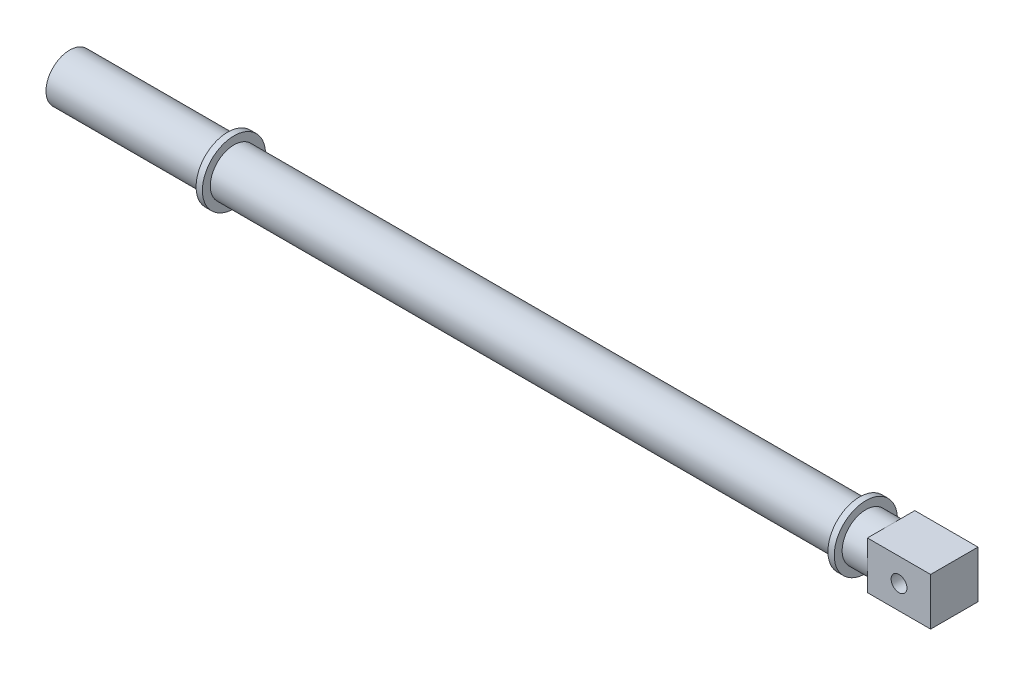
ISO-10303-21;
HEADER;
FILE_DESCRIPTION(('STEP AP214'),'2;1');
FILE_NAME('part.step','',(''),(''),'','','');
FILE_SCHEMA(('AUTOMOTIVE_DESIGN { 1 0 10303 214 1 1 1 1 }'));
ENDSEC;
DATA;
#1=APPLICATION_CONTEXT('core data for automotive mechanical design processes');
#2=APPLICATION_PROTOCOL_DEFINITION('international standard','automotive_design',2000,#1);
#3=PRODUCT_CONTEXT('',#1,'mechanical');
#4=PRODUCT('Part','Part','',(#3));
#5=PRODUCT_RELATED_PRODUCT_CATEGORY('part','',(#4));
#6=PRODUCT_DEFINITION_FORMATION('','',#4);
#7=PRODUCT_DEFINITION_CONTEXT('part definition',#1,'design');
#8=PRODUCT_DEFINITION('design','',#6,#7);
#9=PRODUCT_DEFINITION_SHAPE('','',#8);
#10=(LENGTH_UNIT() NAMED_UNIT(*) SI_UNIT(.MILLI.,.METRE.));
#11=(NAMED_UNIT(*) PLANE_ANGLE_UNIT() SI_UNIT($,.RADIAN.));
#12=(NAMED_UNIT(*) SI_UNIT($,.STERADIAN.) SOLID_ANGLE_UNIT());
#13=UNCERTAINTY_MEASURE_WITH_UNIT(LENGTH_MEASURE(1.E-05),#10,'distance_accuracy_value','');
#14=(GEOMETRIC_REPRESENTATION_CONTEXT(3) GLOBAL_UNCERTAINTY_ASSIGNED_CONTEXT((#13)) GLOBAL_UNIT_ASSIGNED_CONTEXT((#10,
#11,#12)) REPRESENTATION_CONTEXT('',''));
#15=CARTESIAN_POINT('',(0.,0.,0.));
#16=DIRECTION('',(0.,0.,1.));
#17=DIRECTION('',(1.,0.,0.));
#18=AXIS2_PLACEMENT_3D('',#15,#16,#17);
#19=CARTESIAN_POINT('',(0.,0.,0.));
#20=DIRECTION('',(-1.,0.,0.));
#21=DIRECTION('',(0.,0.,1.));
#22=AXIS2_PLACEMENT_3D('',#19,#20,#21);
#23=CYLINDRICAL_SURFACE('',#22,7.5);
#24=CARTESIAN_POINT('',(52.,0.,0.));
#25=DIRECTION('',(1.,0.,0.));
#26=DIRECTION('',(0.,0.,-1.));
#27=AXIS2_PLACEMENT_3D('',#24,#25,#26);
#28=CIRCLE('',#27,7.5);
#29=CARTESIAN_POINT('',(52.,0.,-7.5));
#30=VERTEX_POINT('',#29);
#31=EDGE_CURVE('E156',#30,#30,#28,.F.);
#32=ORIENTED_EDGE('',*,*,#31,.F.);
#33=EDGE_LOOP('',(#32));
#34=FACE_BOUND('',#33,.T.);
#35=CARTESIAN_POINT('',(250.,0.,0.));
#36=DIRECTION('',(-1.,0.,0.));
#37=DIRECTION('',(0.,0.,1.));
#38=AXIS2_PLACEMENT_3D('',#35,#36,#37);
#39=CIRCLE('',#38,7.5);
#40=CARTESIAN_POINT('',(250.,0.,7.5));
#41=VERTEX_POINT('',#40);
#42=EDGE_CURVE('E153',#41,#41,#39,.F.);
#43=ORIENTED_EDGE('',*,*,#42,.F.);
#44=EDGE_LOOP('',(#43));
#45=FACE_BOUND('',#44,.T.);
#46=ADVANCED_FACE('F33',(#34,#45),#23,.T.);
#47=CARTESIAN_POINT('',(250.,-10.,0.));
#48=DIRECTION('',(-1.,0.,0.));
#49=DIRECTION('',(0.,0.,1.));
#50=AXIS2_PLACEMENT_3D('',#47,#48,#49);
#51=PLANE('',#50);
#52=ORIENTED_EDGE('',*,*,#42,.T.);
#53=EDGE_LOOP('',(#52));
#54=FACE_BOUND('',#53,.T.);
#55=CARTESIAN_POINT('',(250.,0.,0.));
#56=DIRECTION('',(-1.,0.,0.));
#57=DIRECTION('',(0.,0.,1.));
#58=AXIS2_PLACEMENT_3D('',#55,#56,#57);
#59=CIRCLE('',#58,10.);
#60=CARTESIAN_POINT('',(250.,0.,10.));
#61=VERTEX_POINT('',#60);
#62=EDGE_CURVE('E141',#61,#61,#59,.T.);
#63=ORIENTED_EDGE('',*,*,#62,.T.);
#64=EDGE_LOOP('',(#63));
#65=FACE_BOUND('',#64,.T.);
#66=ADVANCED_FACE('F196',(#54,#65),#51,.T.);
#67=CARTESIAN_POINT('',(252.,0.,0.));
#68=DIRECTION('',(1.,0.,0.));
#69=DIRECTION('',(0.,0.,-1.));
#70=AXIS2_PLACEMENT_3D('',#67,#68,#69);
#71=PLANE('',#70);
#72=CARTESIAN_POINT('',(252.,0.,0.));
#73=DIRECTION('',(1.,0.,0.));
#74=DIRECTION('',(0.,0.,-1.));
#75=AXIS2_PLACEMENT_3D('',#72,#73,#74);
#76=CIRCLE('',#75,7.5);
#77=CARTESIAN_POINT('',(252.,0.,-7.5));
#78=VERTEX_POINT('',#77);
#79=EDGE_CURVE('E150',#78,#78,#76,.F.);
#80=ORIENTED_EDGE('',*,*,#79,.T.);
#81=EDGE_LOOP('',(#80));
#82=FACE_BOUND('',#81,.T.);
#83=CARTESIAN_POINT('',(252.,0.,0.));
#84=DIRECTION('',(-1.,0.,0.));
#85=DIRECTION('',(0.,0.,1.));
#86=AXIS2_PLACEMENT_3D('',#83,#84,#85);
#87=CIRCLE('',#86,10.);
#88=CARTESIAN_POINT('',(252.,0.,10.));
#89=VERTEX_POINT('',#88);
#90=EDGE_CURVE('E144',#89,#89,#87,.T.);
#91=ORIENTED_EDGE('',*,*,#90,.F.);
#92=EDGE_LOOP('',(#91));
#93=FACE_BOUND('',#92,.T.);
#94=ADVANCED_FACE('F203',(#82,#93),#71,.T.);
#95=CARTESIAN_POINT('',(50.,0.,0.));
#96=DIRECTION('',(-1.,0.,0.));
#97=DIRECTION('',(0.,0.,1.));
#98=AXIS2_PLACEMENT_3D('',#95,#96,#97);
#99=CYLINDRICAL_SURFACE('',#98,10.);
#100=ORIENTED_EDGE('',*,*,#90,.T.);
#101=EDGE_LOOP('',(#100));
#102=FACE_BOUND('',#101,.T.);
#103=ORIENTED_EDGE('',*,*,#62,.F.);
#104=EDGE_LOOP('',(#103));
#105=FACE_BOUND('',#104,.T.);
#106=ADVANCED_FACE('F210',(#102,#105),#99,.T.);
#107=CARTESIAN_POINT('',(260.,0.,0.));
#108=DIRECTION('',(-1.,0.,0.));
#109=DIRECTION('',(0.,0.,1.));
#110=AXIS2_PLACEMENT_3D('',#107,#108,#109);
#111=CIRCLE('',#110,7.5);
#112=CARTESIAN_POINT('',(260.,0.,7.5));
#113=VERTEX_POINT('',#112);
#114=CARTESIAN_POINT('',(260.,-7.5,0.));
#115=VERTEX_POINT('',#114);
#116=EDGE_CURVE('E11',#113,#115,#111,.F.);
#117=ORIENTED_EDGE('',*,*,#116,.F.);
#118=CARTESIAN_POINT('',(260.,7.5,0.));
#119=VERTEX_POINT('',#118);
#120=EDGE_CURVE('E37',#119,#113,#111,.F.);
#121=ORIENTED_EDGE('',*,*,#120,.F.);
#122=CARTESIAN_POINT('',(260.,0.,-7.5));
#123=VERTEX_POINT('',#122);
#124=EDGE_CURVE('E52',#123,#119,#111,.F.);
#125=ORIENTED_EDGE('',*,*,#124,.F.);
#126=EDGE_CURVE('E42',#115,#123,#111,.F.);
#127=ORIENTED_EDGE('',*,*,#126,.F.);
#128=EDGE_LOOP('',(#117,#121,#125,#127));
#129=FACE_BOUND('',#128,.T.);
#130=ORIENTED_EDGE('',*,*,#79,.F.);
#131=EDGE_LOOP('',(#130));
#132=FACE_BOUND('',#131,.T.);
#133=ADVANCED_FACE('F198',(#129,#132),#23,.T.);
#134=CARTESIAN_POINT('',(50.,0.,0.));
#135=DIRECTION('',(-1.,0.,0.));
#136=DIRECTION('',(0.,0.,1.));
#137=AXIS2_PLACEMENT_3D('',#134,#135,#136);
#138=CYLINDRICAL_SURFACE('',#137,10.);
#139=CARTESIAN_POINT('',(52.,0.,0.));
#140=DIRECTION('',(-1.,0.,0.));
#141=DIRECTION('',(0.,0.,1.));
#142=AXIS2_PLACEMENT_3D('',#139,#140,#141);
#143=CIRCLE('',#142,10.);
#144=CARTESIAN_POINT('',(52.,0.,10.));
#145=VERTEX_POINT('',#144);
#146=EDGE_CURVE('E129',#145,#145,#143,.T.);
#147=ORIENTED_EDGE('',*,*,#146,.T.);
#148=EDGE_LOOP('',(#147));
#149=FACE_BOUND('',#148,.T.);
#150=CARTESIAN_POINT('',(50.,0.,0.));
#151=DIRECTION('',(-1.,0.,0.));
#152=DIRECTION('',(0.,0.,1.));
#153=AXIS2_PLACEMENT_3D('',#150,#151,#152);
#154=CIRCLE('',#153,10.);
#155=CARTESIAN_POINT('',(50.,0.,10.));
#156=VERTEX_POINT('',#155);
#157=EDGE_CURVE('E138',#156,#156,#154,.T.);
#158=ORIENTED_EDGE('',*,*,#157,.F.);
#159=EDGE_LOOP('',(#158));
#160=FACE_BOUND('',#159,.T.);
#161=ADVANCED_FACE('F209',(#149,#160),#138,.T.);
#162=CARTESIAN_POINT('',(50.,-10.,0.));
#163=DIRECTION('',(-1.,0.,0.));
#164=DIRECTION('',(0.,0.,1.));
#165=AXIS2_PLACEMENT_3D('',#162,#163,#164);
#166=PLANE('',#165);
#167=CARTESIAN_POINT('',(50.,0.,0.));
#168=DIRECTION('',(-1.,0.,0.));
#169=DIRECTION('',(0.,0.,1.));
#170=AXIS2_PLACEMENT_3D('',#167,#168,#169);
#171=CIRCLE('',#170,7.5);
#172=CARTESIAN_POINT('',(50.,0.,7.5));
#173=VERTEX_POINT('',#172);
#174=EDGE_CURVE('E158',#173,#173,#171,.F.);
#175=ORIENTED_EDGE('',*,*,#174,.T.);
#176=EDGE_LOOP('',(#175));
#177=FACE_BOUND('',#176,.T.);
#178=ORIENTED_EDGE('',*,*,#157,.T.);
#179=EDGE_LOOP('',(#178));
#180=FACE_BOUND('',#179,.T.);
#181=ADVANCED_FACE('F224',(#177,#180),#166,.T.);
#182=CARTESIAN_POINT('',(52.,0.,0.));
#183=DIRECTION('',(1.,0.,0.));
#184=DIRECTION('',(0.,0.,-1.));
#185=AXIS2_PLACEMENT_3D('',#182,#183,#184);
#186=PLANE('',#185);
#187=ORIENTED_EDGE('',*,*,#31,.T.);
#188=EDGE_LOOP('',(#187));
#189=FACE_BOUND('',#188,.T.);
#190=ORIENTED_EDGE('',*,*,#146,.F.);
#191=EDGE_LOOP('',(#190));
#192=FACE_BOUND('',#191,.T.);
#193=ADVANCED_FACE('F217',(#189,#192),#186,.T.);
#194=CARTESIAN_POINT('',(0.,0.,0.));
#195=DIRECTION('',(-1.,0.,0.));
#196=DIRECTION('',(0.,0.,1.));
#197=AXIS2_PLACEMENT_3D('',#194,#195,#196);
#198=PLANE('',#197);
#199=CARTESIAN_POINT('',(0.,0.,0.));
#200=DIRECTION('',(-1.,0.,0.));
#201=DIRECTION('',(0.,0.,1.));
#202=AXIS2_PLACEMENT_3D('',#199,#200,#201);
#203=CIRCLE('',#202,7.5);
#204=CARTESIAN_POINT('',(0.,0.,7.5));
#205=VERTEX_POINT('',#204);
#206=EDGE_CURVE('E147',#205,#205,#203,.T.);
#207=ORIENTED_EDGE('',*,*,#206,.T.);
#208=EDGE_LOOP('',(#207));
#209=FACE_BOUND('',#208,.T.);
#210=ADVANCED_FACE('F35',(#209),#198,.T.);
#211=ORIENTED_EDGE('',*,*,#174,.F.);
#212=EDGE_LOOP('',(#211));
#213=FACE_BOUND('',#212,.T.);
#214=ORIENTED_EDGE('',*,*,#206,.F.);
#215=EDGE_LOOP('',(#214));
#216=FACE_BOUND('',#215,.T.);
#217=ADVANCED_FACE('F199',(#213,#216),#23,.T.);
#218=CARTESIAN_POINT('',(260.,-7.5,-7.5));
#219=DIRECTION('',(0.,-1.,0.));
#220=DIRECTION('',(0.,0.,-1.));
#221=AXIS2_PLACEMENT_3D('',#218,#219,#220);
#222=PLANE('',#221);
#223=DIRECTION('',(0.,0.,1.));
#224=VECTOR('',#223,1.);
#225=CARTESIAN_POINT('',(280.,-7.5,-7.5));
#226=LINE('',#225,#224);
#227=CARTESIAN_POINT('',(280.,-7.5,-7.5));
#228=VERTEX_POINT('',#227);
#229=CARTESIAN_POINT('',(280.,-7.5,7.5));
#230=VERTEX_POINT('',#229);
#231=EDGE_CURVE('E127',#228,#230,#226,.T.);
#232=ORIENTED_EDGE('',*,*,#231,.T.);
#233=DIRECTION('',(1.,0.,0.));
#234=VECTOR('',#233,1.);
#235=CARTESIAN_POINT('',(260.,-7.5,7.5));
#236=LINE('',#235,#234);
#237=CARTESIAN_POINT('',(260.,-7.5,7.5));
#238=VERTEX_POINT('',#237);
#239=EDGE_CURVE('E93',#238,#230,#236,.T.);
#240=ORIENTED_EDGE('',*,*,#239,.F.);
#241=DIRECTION('',(0.,0.,1.));
#242=VECTOR('',#241,1.);
#243=CARTESIAN_POINT('',(260.,-7.5,-7.5));
#244=LINE('',#243,#242);
#245=EDGE_CURVE('E133',#115,#238,#244,.T.);
#246=ORIENTED_EDGE('',*,*,#245,.F.);
#247=CARTESIAN_POINT('',(260.,-7.5,-7.5));
#248=VERTEX_POINT('',#247);
#249=EDGE_CURVE('E130',#248,#115,#244,.T.);
#250=ORIENTED_EDGE('',*,*,#249,.F.);
#251=DIRECTION('',(1.,0.,0.));
#252=VECTOR('',#251,1.);
#253=CARTESIAN_POINT('',(260.,-7.5,-7.5));
#254=LINE('',#253,#252);
#255=EDGE_CURVE('E106',#248,#228,#254,.T.);
#256=ORIENTED_EDGE('',*,*,#255,.T.);
#257=EDGE_LOOP('',(#232,#240,#246,#250,#256));
#258=FACE_BOUND('',#257,.T.);
#259=ADVANCED_FACE('F176',(#258),#222,.T.);
#260=CARTESIAN_POINT('',(260.,7.5,-7.5));
#261=DIRECTION('',(-1.,0.,0.));
#262=DIRECTION('',(0.,0.,1.));
#263=AXIS2_PLACEMENT_3D('',#260,#261,#262);
#264=PLANE('',#263);
#265=DIRECTION('',(0.,-1.,0.));
#266=VECTOR('',#265,1.);
#267=CARTESIAN_POINT('',(260.,7.5,7.5));
#268=LINE('',#267,#266);
#269=EDGE_CURVE('E111',#113,#238,#268,.T.);
#270=ORIENTED_EDGE('',*,*,#269,.F.);
#271=ORIENTED_EDGE('',*,*,#116,.T.);
#272=ORIENTED_EDGE('',*,*,#245,.T.);
#273=EDGE_LOOP('',(#270,#271,#272));
#274=FACE_BOUND('',#273,.T.);
#275=ADVANCED_FACE('F179',(#274),#264,.T.);
#276=ORIENTED_EDGE('',*,*,#249,.T.);
#277=ORIENTED_EDGE('',*,*,#126,.T.);
#278=DIRECTION('',(0.,-1.,0.));
#279=VECTOR('',#278,1.);
#280=CARTESIAN_POINT('',(260.,7.5,-7.5));
#281=LINE('',#280,#279);
#282=EDGE_CURVE('E121',#123,#248,#281,.T.);
#283=ORIENTED_EDGE('',*,*,#282,.T.);
#284=EDGE_LOOP('',(#276,#277,#283));
#285=FACE_BOUND('',#284,.T.);
#286=ADVANCED_FACE('F168',(#285),#264,.T.);
#287=CARTESIAN_POINT('',(260.,7.5,-7.5));
#288=VERTEX_POINT('',#287);
#289=EDGE_CURVE('E122',#288,#123,#281,.T.);
#290=ORIENTED_EDGE('',*,*,#289,.T.);
#291=ORIENTED_EDGE('',*,*,#124,.T.);
#292=DIRECTION('',(0.,0.,1.));
#293=VECTOR('',#292,1.);
#294=CARTESIAN_POINT('',(260.,7.5,-7.5));
#295=LINE('',#294,#293);
#296=EDGE_CURVE('E134',#288,#119,#295,.T.);
#297=ORIENTED_EDGE('',*,*,#296,.F.);
#298=EDGE_LOOP('',(#290,#291,#297));
#299=FACE_BOUND('',#298,.T.);
#300=ADVANCED_FACE('F174',(#299),#264,.T.);
#301=CARTESIAN_POINT('',(260.,7.5,-7.5));
#302=DIRECTION('',(0.,1.,0.));
#303=DIRECTION('',(0.,0.,1.));
#304=AXIS2_PLACEMENT_3D('',#301,#302,#303);
#305=PLANE('',#304);
#306=DIRECTION('',(0.,0.,1.));
#307=VECTOR('',#306,1.);
#308=CARTESIAN_POINT('',(280.,7.5,-7.5));
#309=LINE('',#308,#307);
#310=CARTESIAN_POINT('',(280.,7.5,-7.5));
#311=VERTEX_POINT('',#310);
#312=CARTESIAN_POINT('',(280.,7.5,7.5));
#313=VERTEX_POINT('',#312);
#314=EDGE_CURVE('E98',#311,#313,#309,.T.);
#315=ORIENTED_EDGE('',*,*,#314,.F.);
#316=DIRECTION('',(-1.,0.,0.));
#317=VECTOR('',#316,1.);
#318=CARTESIAN_POINT('',(260.,7.5,-7.5));
#319=LINE('',#318,#317);
#320=EDGE_CURVE('E119',#311,#288,#319,.T.);
#321=ORIENTED_EDGE('',*,*,#320,.T.);
#322=ORIENTED_EDGE('',*,*,#296,.T.);
#323=CARTESIAN_POINT('',(260.,7.5,7.5));
#324=VERTEX_POINT('',#323);
#325=EDGE_CURVE('E105',#119,#324,#295,.T.);
#326=ORIENTED_EDGE('',*,*,#325,.T.);
#327=DIRECTION('',(-1.,0.,0.));
#328=VECTOR('',#327,1.);
#329=CARTESIAN_POINT('',(260.,7.5,7.5));
#330=LINE('',#329,#328);
#331=EDGE_CURVE('E89',#313,#324,#330,.T.);
#332=ORIENTED_EDGE('',*,*,#331,.F.);
#333=EDGE_LOOP('',(#315,#321,#322,#326,#332));
#334=FACE_BOUND('',#333,.T.);
#335=ADVANCED_FACE('F108',(#334),#305,.T.);
#336=CARTESIAN_POINT('',(0.,0.,-7.5));
#337=DIRECTION('',(0.,0.,1.));
#338=DIRECTION('',(1.,0.,0.));
#339=AXIS2_PLACEMENT_3D('',#336,#337,#338);
#340=PLANE('',#339);
#341=CARTESIAN_POINT('',(270.,0.,-7.5));
#342=DIRECTION('',(0.,0.,1.));
#343=DIRECTION('',(1.,0.,0.));
#344=AXIS2_PLACEMENT_3D('',#341,#342,#343);
#345=CIRCLE('',#344,2.50000000000002);
#346=CARTESIAN_POINT('',(272.5,0.,-7.5));
#347=VERTEX_POINT('',#346);
#348=EDGE_CURVE('E370',#347,#347,#345,.T.);
#349=ORIENTED_EDGE('',*,*,#348,.T.);
#350=EDGE_LOOP('',(#349));
#351=FACE_BOUND('',#350,.T.);
#352=ORIENTED_EDGE('',*,*,#282,.F.);
#353=ORIENTED_EDGE('',*,*,#289,.F.);
#354=ORIENTED_EDGE('',*,*,#320,.F.);
#355=DIRECTION('',(0.,1.,0.));
#356=VECTOR('',#355,1.);
#357=CARTESIAN_POINT('',(280.,7.5,-7.5));
#358=LINE('',#357,#356);
#359=EDGE_CURVE('E101',#228,#311,#358,.T.);
#360=ORIENTED_EDGE('',*,*,#359,.F.);
#361=ORIENTED_EDGE('',*,*,#255,.F.);
#362=EDGE_LOOP('',(#352,#353,#354,#360,#361));
#363=FACE_BOUND('',#362,.T.);
#364=ADVANCED_FACE('F173',(#351,#363),#340,.F.);
#365=CARTESIAN_POINT('',(0.,0.,7.5));
#366=DIRECTION('',(0.,0.,1.));
#367=DIRECTION('',(1.,0.,0.));
#368=AXIS2_PLACEMENT_3D('',#365,#366,#367);
#369=PLANE('',#368);
#370=CARTESIAN_POINT('',(270.,0.,7.5));
#371=DIRECTION('',(0.,0.,1.));
#372=DIRECTION('',(1.,0.,0.));
#373=AXIS2_PLACEMENT_3D('',#370,#371,#372);
#374=CIRCLE('',#373,2.50000000000002);
#375=CARTESIAN_POINT('',(272.5,0.,7.5));
#376=VERTEX_POINT('',#375);
#377=EDGE_CURVE('E95',#376,#376,#374,.T.);
#378=ORIENTED_EDGE('',*,*,#377,.F.);
#379=EDGE_LOOP('',(#378));
#380=FACE_BOUND('',#379,.T.);
#381=DIRECTION('',(0.,1.,0.));
#382=VECTOR('',#381,1.);
#383=CARTESIAN_POINT('',(280.,7.5,7.5));
#384=LINE('',#383,#382);
#385=EDGE_CURVE('E84',#230,#313,#384,.T.);
#386=ORIENTED_EDGE('',*,*,#385,.T.);
#387=ORIENTED_EDGE('',*,*,#331,.T.);
#388=EDGE_CURVE('E113',#324,#113,#268,.T.);
#389=ORIENTED_EDGE('',*,*,#388,.T.);
#390=ORIENTED_EDGE('',*,*,#269,.T.);
#391=ORIENTED_EDGE('',*,*,#239,.T.);
#392=EDGE_LOOP('',(#386,#387,#389,#390,#391));
#393=FACE_BOUND('',#392,.T.);
#394=ADVANCED_FACE('F86',(#380,#393),#369,.T.);
#395=ORIENTED_EDGE('',*,*,#325,.F.);
#396=ORIENTED_EDGE('',*,*,#120,.T.);
#397=ORIENTED_EDGE('',*,*,#388,.F.);
#398=EDGE_LOOP('',(#395,#396,#397));
#399=FACE_BOUND('',#398,.T.);
#400=ADVANCED_FACE('F180',(#399),#264,.T.);
#401=CARTESIAN_POINT('',(280.,0.,0.));
#402=DIRECTION('',(1.,0.,0.));
#403=DIRECTION('',(0.,0.,-1.));
#404=AXIS2_PLACEMENT_3D('',#401,#402,#403);
#405=PLANE('',#404);
#406=ORIENTED_EDGE('',*,*,#359,.T.);
#407=ORIENTED_EDGE('',*,*,#314,.T.);
#408=ORIENTED_EDGE('',*,*,#385,.F.);
#409=ORIENTED_EDGE('',*,*,#231,.F.);
#410=EDGE_LOOP('',(#406,#407,#408,#409));
#411=FACE_BOUND('',#410,.T.);
#412=ADVANCED_FACE('F99',(#411),#405,.T.);
#413=CARTESIAN_POINT('',(270.,0.,7.5));
#414=DIRECTION('',(0.,0.,-1.));
#415=DIRECTION('',(-1.,0.,0.));
#416=AXIS2_PLACEMENT_3D('',#413,#414,#415);
#417=CYLINDRICAL_SURFACE('',#416,2.50000000000002);
#418=ORIENTED_EDGE('',*,*,#377,.T.);
#419=EDGE_LOOP('',(#418));
#420=FACE_BOUND('',#419,.T.);
#421=ORIENTED_EDGE('',*,*,#348,.F.);
#422=EDGE_LOOP('',(#421));
#423=FACE_BOUND('',#422,.T.);
#424=ADVANCED_FACE('F187',(#420,#423),#417,.F.);
#425=CLOSED_SHELL('',(#46,#66,#94,#106,#133,#161,#181,#193,#210,#217,#259,#275,#286,#300,#335,
#364,#394,#400,#412,#424));
#426=MANIFOLD_SOLID_BREP('B2',#425);
#427=ADVANCED_BREP_SHAPE_REPRESENTATION('',(#18,#426),#14);
#428=SHAPE_DEFINITION_REPRESENTATION(#9,#427);
ENDSEC;
END-ISO-10303-21;
